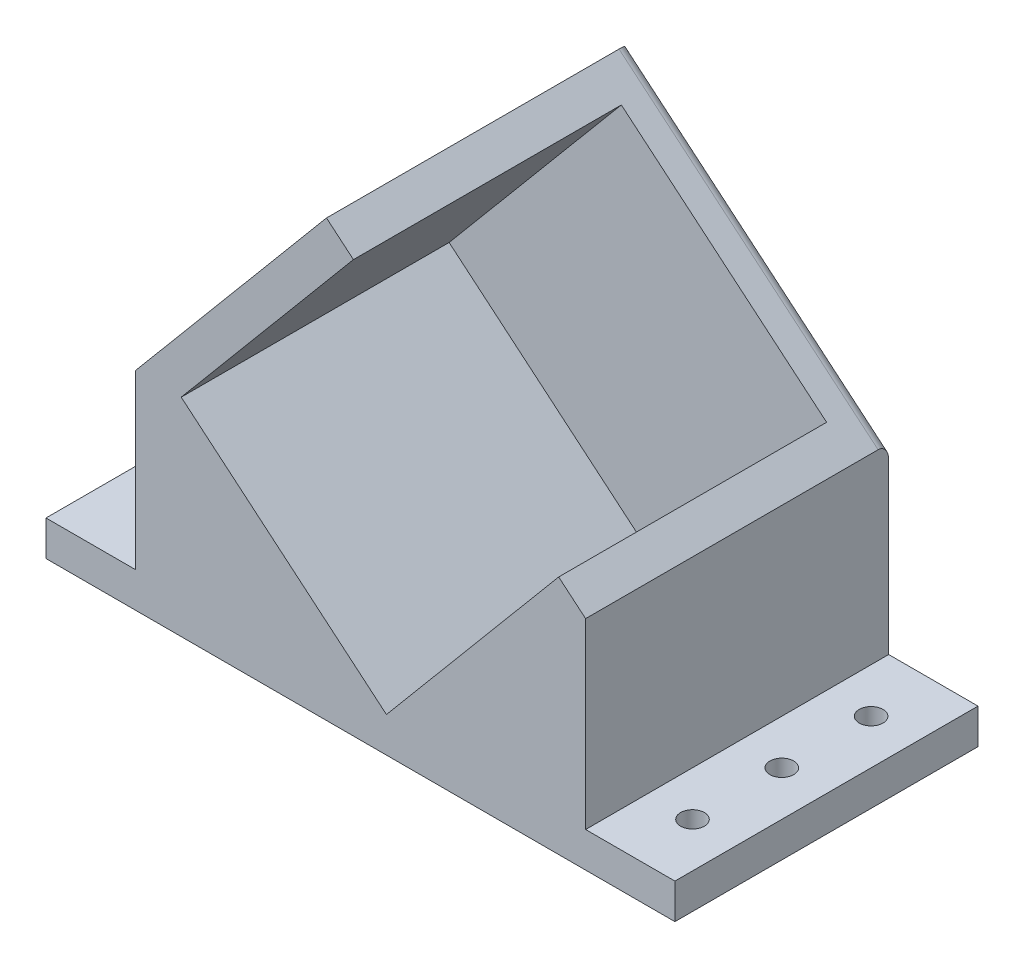
ISO-10303-21;
HEADER;
FILE_DESCRIPTION(('STEP AP214'),'2;1');
FILE_NAME('part.step','',(''),(''),'','','');
FILE_SCHEMA(('AUTOMOTIVE_DESIGN { 1 0 10303 214 1 1 1 1 }'));
ENDSEC;
DATA;
#1=APPLICATION_CONTEXT('core data for automotive mechanical design processes');
#2=APPLICATION_PROTOCOL_DEFINITION('international standard','automotive_design',2000,#1);
#3=PRODUCT_CONTEXT('',#1,'mechanical');
#4=PRODUCT('Part','Part','',(#3));
#5=PRODUCT_RELATED_PRODUCT_CATEGORY('part','',(#4));
#6=PRODUCT_DEFINITION_FORMATION('','',#4);
#7=PRODUCT_DEFINITION_CONTEXT('part definition',#1,'design');
#8=PRODUCT_DEFINITION('design','',#6,#7);
#9=PRODUCT_DEFINITION_SHAPE('','',#8);
#10=(LENGTH_UNIT() NAMED_UNIT(*) SI_UNIT(.MILLI.,.METRE.));
#11=(NAMED_UNIT(*) PLANE_ANGLE_UNIT() SI_UNIT($,.RADIAN.));
#12=(NAMED_UNIT(*) SI_UNIT($,.STERADIAN.) SOLID_ANGLE_UNIT());
#13=UNCERTAINTY_MEASURE_WITH_UNIT(LENGTH_MEASURE(1.E-05),#10,'distance_accuracy_value','');
#14=(GEOMETRIC_REPRESENTATION_CONTEXT(3) GLOBAL_UNCERTAINTY_ASSIGNED_CONTEXT((#13)) GLOBAL_UNIT_ASSIGNED_CONTEXT((#10,
#11,#12)) REPRESENTATION_CONTEXT('',''));
#15=CARTESIAN_POINT('',(0.,0.,0.));
#16=DIRECTION('',(0.,0.,1.));
#17=DIRECTION('',(1.,0.,0.));
#18=AXIS2_PLACEMENT_3D('',#15,#16,#17);
#19=CARTESIAN_POINT('',(29.186293282833,-24.4902079290572,-76.2));
#20=DIRECTION('',(-0.64278760968654,-0.766044443118977,0.));
#21=DIRECTION('',(0.766044443118977,-0.64278760968654,0.));
#22=AXIS2_PLACEMENT_3D('',#19,#20,#21);
#23=PLANE('',#22);
#24=DIRECTION('',(-0.766044443118977,0.64278760968654,0.));
#25=VECTOR('',#24,1.);
#26=CARTESIAN_POINT('',(29.186293282833,-24.4902079290572,0.));
#27=LINE('',#26,#25);
#28=CARTESIAN_POINT('',(29.186293282833,-24.4902079290572,0.));
#29=VERTEX_POINT('',#28);
#30=CARTESIAN_POINT('',(-29.186293282833,24.4902079290572,0.));
#31=VERTEX_POINT('',#30);
#32=EDGE_CURVE('E284',#29,#31,#27,.T.);
#33=ORIENTED_EDGE('',*,*,#32,.F.);
#34=DIRECTION('',(0.,0.,1.));
#35=VECTOR('',#34,1.);
#36=CARTESIAN_POINT('',(29.186293282833,-24.4902079290572,-76.2));
#37=LINE('',#36,#35);
#38=CARTESIAN_POINT('',(29.186293282833,-24.4902079290572,-76.2));
#39=VERTEX_POINT('',#38);
#40=EDGE_CURVE('E295',#39,#29,#37,.T.);
#41=ORIENTED_EDGE('',*,*,#40,.F.);
#42=DIRECTION('',(-0.766044443118977,0.64278760968654,0.));
#43=VECTOR('',#42,1.);
#44=CARTESIAN_POINT('',(29.186293282833,-24.4902079290572,-76.2));
#45=LINE('',#44,#43);
#46=CARTESIAN_POINT('',(-29.186293282833,24.4902079290572,-76.2));
#47=VERTEX_POINT('',#46);
#48=EDGE_CURVE('E286',#39,#47,#45,.T.);
#49=ORIENTED_EDGE('',*,*,#48,.T.);
#50=DIRECTION('',(0.,0.,1.));
#51=VECTOR('',#50,1.);
#52=CARTESIAN_POINT('',(-29.186293282833,24.4902079290572,-76.2));
#53=LINE('',#52,#51);
#54=EDGE_CURVE('E332',#47,#31,#53,.T.);
#55=ORIENTED_EDGE('',*,*,#54,.T.);
#56=EDGE_LOOP('',(#33,#41,#49,#55));
#57=FACE_BOUND('',#56,.T.);
#58=ADVANCED_FACE('F37',(#57),#23,.F.);
#59=CARTESIAN_POINT('',(-29.186293282833,24.4902079290572,-76.2));
#60=DIRECTION('',(-0.766044443118977,0.642787609686541,0.));
#61=DIRECTION('',(-0.642787609686541,-0.766044443118977,0.));
#62=AXIS2_PLACEMENT_3D('',#59,#60,#61);
#63=PLANE('',#62);
#64=DIRECTION('',(0.642787609686541,0.766044443118977,0.));
#65=VECTOR('',#64,1.);
#66=CARTESIAN_POINT('',(-29.186293282833,24.4902079290572,0.));
#67=LINE('',#66,#65);
#68=CARTESIAN_POINT('',(19.7941225752814,82.8627944947232,0.));
#69=VERTEX_POINT('',#68);
#70=EDGE_CURVE('E297',#31,#69,#67,.T.);
#71=ORIENTED_EDGE('',*,*,#70,.F.);
#72=ORIENTED_EDGE('',*,*,#54,.F.);
#73=DIRECTION('',(0.642787609686541,0.766044443118977,0.));
#74=VECTOR('',#73,1.);
#75=CARTESIAN_POINT('',(-29.186293282833,24.4902079290572,-76.2));
#76=LINE('',#75,#74);
#77=CARTESIAN_POINT('',(19.7941225752814,82.8627944947232,-76.2));
#78=VERTEX_POINT('',#77);
#79=EDGE_CURVE('E289',#47,#78,#76,.T.);
#80=ORIENTED_EDGE('',*,*,#79,.T.);
#81=DIRECTION('',(0.,0.,1.));
#82=VECTOR('',#81,1.);
#83=CARTESIAN_POINT('',(19.7941225752814,82.8627944947232,-76.2));
#84=LINE('',#83,#82);
#85=EDGE_CURVE('E329',#78,#69,#84,.T.);
#86=ORIENTED_EDGE('',*,*,#85,.T.);
#87=EDGE_LOOP('',(#71,#72,#80,#86));
#88=FACE_BOUND('',#87,.T.);
#89=ADVANCED_FACE('F438',(#88),#63,.F.);
#90=CARTESIAN_POINT('',(-42.2403661761558,24.4902079290572,-76.2));
#91=DIRECTION('',(0.766044443118978,-0.64278760968654,0.));
#92=DIRECTION('',(0.64278760968654,0.766044443118978,0.));
#93=AXIS2_PLACEMENT_3D('',#90,#91,#92);
#94=PLANE('',#93);
#95=DIRECTION('',(-0.64278760968654,-0.766044443118978,0.));
#96=VECTOR('',#95,1.);
#97=CARTESIAN_POINT('',(-42.2403661761558,24.4902079290572,-86.2));
#98=LINE('',#97,#96);
#99=CARTESIAN_POINT('',(10.205315315032,86.9925372622317,-86.2));
#100=VERTEX_POINT('',#99);
#101=CARTESIAN_POINT('',(-42.2403661761558,24.4902079290572,-86.2));
#102=VERTEX_POINT('',#101);
#103=EDGE_CURVE('E272',#100,#102,#98,.T.);
#104=ORIENTED_EDGE('',*,*,#103,.T.);
#105=DIRECTION('',(0.,0.,1.));
#106=VECTOR('',#105,1.);
#107=CARTESIAN_POINT('',(-42.2403661761558,24.4902079290572,-76.2));
#108=LINE('',#107,#106);
#109=CARTESIAN_POINT('',(-42.2403661761558,24.4902079290572,0.));
#110=VERTEX_POINT('',#109);
#111=EDGE_CURVE('E323',#102,#110,#108,.T.);
#112=ORIENTED_EDGE('',*,*,#111,.T.);
#113=DIRECTION('',(-0.64278760968654,-0.766044443118978,0.));
#114=VECTOR('',#113,1.);
#115=CARTESIAN_POINT('',(-42.2403661761558,24.4902079290572,0.));
#116=LINE('',#115,#114);
#117=CARTESIAN_POINT('',(12.1336781440916,89.2906705915887,0.));
#118=VERTEX_POINT('',#117);
#119=EDGE_CURVE('E302',#118,#110,#116,.T.);
#120=ORIENTED_EDGE('',*,*,#119,.F.);
#121=DIRECTION('',(0.,0.,1.));
#122=VECTOR('',#121,1.);
#123=CARTESIAN_POINT('',(12.1336781440916,89.2906705915887,-76.2));
#124=LINE('',#123,#122);
#125=CARTESIAN_POINT('',(12.1336781440916,89.2906705915887,-83.2));
#126=VERTEX_POINT('',#125);
#127=EDGE_CURVE('E326',#126,#118,#124,.T.);
#128=ORIENTED_EDGE('',*,*,#127,.F.);
#129=CARTESIAN_POINT('',(10.205315315032,86.9925372622317,-83.2));
#130=DIRECTION('',(-0.766044443118978,0.64278760968654,0.));
#131=DIRECTION('',(0.64278760968654,0.766044443118978,0.));
#132=AXIS2_PLACEMENT_3D('',#129,#130,#131);
#133=CIRCLE('',#132,3.);
#134=EDGE_CURVE('E377',#100,#126,#133,.F.);
#135=ORIENTED_EDGE('',*,*,#134,.F.);
#136=EDGE_LOOP('',(#104,#112,#120,#128,#135));
#137=FACE_BOUND('',#136,.T.);
#138=ADVANCED_FACE('F444',(#137),#94,.F.);
#139=CARTESIAN_POINT('',(-42.2403661761558,-34.4902079290572,-76.2));
#140=DIRECTION('',(1.,0.,0.));
#141=DIRECTION('',(0.,1.,0.));
#142=AXIS2_PLACEMENT_3D('',#139,#140,#141);
#143=PLANE('',#142);
#144=DIRECTION('',(0.,-1.,0.));
#145=VECTOR('',#144,1.);
#146=CARTESIAN_POINT('',(-42.2403661761558,-34.4902079290572,0.));
#147=LINE('',#146,#145);
#148=CARTESIAN_POINT('',(-42.2403661761558,-24.4902079290572,0.));
#149=VERTEX_POINT('',#148);
#150=EDGE_CURVE('E305',#110,#149,#147,.T.);
#151=ORIENTED_EDGE('',*,*,#150,.F.);
#152=ORIENTED_EDGE('',*,*,#111,.F.);
#153=DIRECTION('',(0.,-1.,0.));
#154=VECTOR('',#153,1.);
#155=CARTESIAN_POINT('',(-42.2403661761558,-34.4902079290572,-86.2));
#156=LINE('',#155,#154);
#157=CARTESIAN_POINT('',(-42.2403661761558,-24.4902079290572,-86.2));
#158=VERTEX_POINT('',#157);
#159=EDGE_CURVE('E275',#102,#158,#156,.T.);
#160=ORIENTED_EDGE('',*,*,#159,.T.);
#161=DIRECTION('',(0.,0.,-1.));
#162=VECTOR('',#161,1.);
#163=CARTESIAN_POINT('',(-42.2403661761558,-24.4902079290572,-86.2));
#164=LINE('',#163,#162);
#165=EDGE_CURVE('E230',#149,#158,#164,.T.);
#166=ORIENTED_EDGE('',*,*,#165,.F.);
#167=EDGE_LOOP('',(#151,#152,#160,#166));
#168=FACE_BOUND('',#167,.T.);
#169=ADVANCED_FACE('F616',(#168),#143,.F.);
#170=CARTESIAN_POINT('',(85.8271535721372,-34.4902079290572,-76.2));
#171=DIRECTION('',(0.,1.,0.));
#172=DIRECTION('',(-1.,0.,0.));
#173=AXIS2_PLACEMENT_3D('',#170,#171,#172);
#174=PLANE('',#173);
#175=CARTESIAN_POINT('',(-54.9403661761558,-34.4902079290572,-68.5));
#176=DIRECTION('',(0.,-1.,0.));
#177=DIRECTION('',(0.,0.,-1.));
#178=AXIS2_PLACEMENT_3D('',#175,#176,#177);
#179=CIRCLE('',#178,3.3782);
#180=CARTESIAN_POINT('',(-54.9403661761558,-34.4902079290572,-71.8782));
#181=VERTEX_POINT('',#180);
#182=EDGE_CURVE('E673',#181,#181,#179,.T.);
#183=ORIENTED_EDGE('',*,*,#182,.F.);
#184=EDGE_LOOP('',(#183));
#185=FACE_BOUND('',#184,.T.);
#186=CARTESIAN_POINT('',(-54.9403661761558,-34.4902079290572,-43.1));
#187=DIRECTION('',(0.,-1.,0.));
#188=DIRECTION('',(0.,0.,-1.));
#189=AXIS2_PLACEMENT_3D('',#186,#187,#188);
#190=CIRCLE('',#189,3.3782);
#191=CARTESIAN_POINT('',(-54.9403661761558,-34.4902079290572,-46.4782));
#192=VERTEX_POINT('',#191);
#193=EDGE_CURVE('E667',#192,#192,#190,.T.);
#194=ORIENTED_EDGE('',*,*,#193,.F.);
#195=EDGE_LOOP('',(#194));
#196=FACE_BOUND('',#195,.T.);
#197=CARTESIAN_POINT('',(-54.9403661761558,-34.4902079290572,-17.7));
#198=DIRECTION('',(0.,-1.,0.));
#199=DIRECTION('',(0.,0.,-1.));
#200=AXIS2_PLACEMENT_3D('',#197,#198,#199);
#201=CIRCLE('',#200,3.3782);
#202=CARTESIAN_POINT('',(-54.9403661761558,-34.4902079290572,-21.0782));
#203=VERTEX_POINT('',#202);
#204=EDGE_CURVE('E661',#203,#203,#201,.T.);
#205=ORIENTED_EDGE('',*,*,#204,.F.);
#206=EDGE_LOOP('',(#205));
#207=FACE_BOUND('',#206,.T.);
#208=CARTESIAN_POINT('',(98.5271535721371,-34.4902079290572,-17.7));
#209=DIRECTION('',(0.,-1.,0.));
#210=DIRECTION('',(0.,0.,-1.));
#211=AXIS2_PLACEMENT_3D('',#208,#209,#210);
#212=CIRCLE('',#211,3.3782);
#213=CARTESIAN_POINT('',(98.5271535721371,-34.4902079290572,-21.0782));
#214=VERTEX_POINT('',#213);
#215=EDGE_CURVE('E655',#214,#214,#212,.T.);
#216=ORIENTED_EDGE('',*,*,#215,.F.);
#217=EDGE_LOOP('',(#216));
#218=FACE_BOUND('',#217,.T.);
#219=CARTESIAN_POINT('',(98.5271535721372,-34.4902079290572,-43.1));
#220=DIRECTION('',(0.,-1.,0.));
#221=DIRECTION('',(0.,0.,-1.));
#222=AXIS2_PLACEMENT_3D('',#219,#220,#221);
#223=CIRCLE('',#222,3.3782);
#224=CARTESIAN_POINT('',(98.5271535721372,-34.4902079290572,-46.4782));
#225=VERTEX_POINT('',#224);
#226=EDGE_CURVE('E649',#225,#225,#223,.T.);
#227=ORIENTED_EDGE('',*,*,#226,.F.);
#228=EDGE_LOOP('',(#227));
#229=FACE_BOUND('',#228,.T.);
#230=CARTESIAN_POINT('',(98.5271535721371,-34.4902079290572,-68.5));
#231=DIRECTION('',(0.,-1.,0.));
#232=DIRECTION('',(0.,0.,-1.));
#233=AXIS2_PLACEMENT_3D('',#230,#231,#232);
#234=CIRCLE('',#233,3.3782);
#235=CARTESIAN_POINT('',(98.5271535721371,-34.4902079290572,-71.8782));
#236=VERTEX_POINT('',#235);
#237=EDGE_CURVE('E639',#236,#236,#234,.T.);
#238=ORIENTED_EDGE('',*,*,#237,.F.);
#239=EDGE_LOOP('',(#238));
#240=FACE_BOUND('',#239,.T.);
#241=DIRECTION('',(1.,0.,0.));
#242=VECTOR('',#241,1.);
#243=CARTESIAN_POINT('',(85.8271535721372,-34.4902079290572,0.));
#244=LINE('',#243,#242);
#245=CARTESIAN_POINT('',(-67.6403661761558,-34.4902079290572,0.));
#246=VERTEX_POINT('',#245);
#247=CARTESIAN_POINT('',(111.227153572137,-34.4902079290572,0.));
#248=VERTEX_POINT('',#247);
#249=EDGE_CURVE('E218',#246,#248,#244,.T.);
#250=ORIENTED_EDGE('',*,*,#249,.F.);
#251=DIRECTION('',(0.,0.,1.));
#252=VECTOR('',#251,1.);
#253=CARTESIAN_POINT('',(-67.6403661761558,-34.4902079290572,0.));
#254=LINE('',#253,#252);
#255=CARTESIAN_POINT('',(-67.6403661761558,-34.4902079290572,-86.2));
#256=VERTEX_POINT('',#255);
#257=EDGE_CURVE('E220',#256,#246,#254,.T.);
#258=ORIENTED_EDGE('',*,*,#257,.F.);
#259=DIRECTION('',(1.,0.,0.));
#260=VECTOR('',#259,1.);
#261=CARTESIAN_POINT('',(85.8271535721372,-34.4902079290572,-86.2));
#262=LINE('',#261,#260);
#263=CARTESIAN_POINT('',(111.227153572137,-34.4902079290572,-86.2));
#264=VERTEX_POINT('',#263);
#265=EDGE_CURVE('E278',#256,#264,#262,.T.);
#266=ORIENTED_EDGE('',*,*,#265,.T.);
#267=DIRECTION('',(0.,0.,-1.));
#268=VECTOR('',#267,1.);
#269=CARTESIAN_POINT('',(111.227153572137,-34.4902079290572,-86.2));
#270=LINE('',#269,#268);
#271=EDGE_CURVE('E637',#248,#264,#270,.T.);
#272=ORIENTED_EDGE('',*,*,#271,.F.);
#273=EDGE_LOOP('',(#250,#258,#266,#272));
#274=FACE_BOUND('',#273,.T.);
#275=ADVANCED_FACE('F612',(#185,#196,#207,#218,#229,#240,#274),#174,.F.);
#276=CARTESIAN_POINT('',(85.8271535721371,27.4545025397435,-76.2));
#277=DIRECTION('',(-1.,0.,0.));
#278=DIRECTION('',(0.,-1.,0.));
#279=AXIS2_PLACEMENT_3D('',#276,#277,#278);
#280=PLANE('',#279);
#281=DIRECTION('',(0.,1.,0.));
#282=VECTOR('',#281,1.);
#283=CARTESIAN_POINT('',(85.8271535721371,27.4545025397435,-86.2));
#284=LINE('',#283,#282);
#285=CARTESIAN_POINT('',(85.8271535721372,-24.4902079290572,-86.2));
#286=VERTEX_POINT('',#285);
#287=CARTESIAN_POINT('',(85.8271535721371,23.5382806717467,-86.2));
#288=VERTEX_POINT('',#287);
#289=EDGE_CURVE('E281',#286,#288,#284,.T.);
#290=ORIENTED_EDGE('',*,*,#289,.T.);
#291=CARTESIAN_POINT('',(85.8271535721371,23.5382806717467,-83.2));
#292=DIRECTION('',(1.,0.,0.));
#293=DIRECTION('',(0.,1.,0.));
#294=AXIS2_PLACEMENT_3D('',#291,#292,#293);
#295=ELLIPSE('',#294,3.91622186799684,3.);
#296=CARTESIAN_POINT('',(85.8271535721371,27.4545025397435,-83.2));
#297=VERTEX_POINT('',#296);
#298=EDGE_CURVE('E382',#297,#288,#295,.F.);
#299=ORIENTED_EDGE('',*,*,#298,.F.);
#300=DIRECTION('',(0.,0.,1.));
#301=VECTOR('',#300,1.);
#302=CARTESIAN_POINT('',(85.8271535721371,27.4545025397435,-76.2));
#303=LINE('',#302,#301);
#304=CARTESIAN_POINT('',(85.8271535721371,27.4545025397435,0.));
#305=VERTEX_POINT('',#304);
#306=EDGE_CURVE('E320',#297,#305,#303,.T.);
#307=ORIENTED_EDGE('',*,*,#306,.T.);
#308=DIRECTION('',(0.,1.,0.));
#309=VECTOR('',#308,1.);
#310=CARTESIAN_POINT('',(85.8271535721371,27.4545025397435,0.));
#311=LINE('',#310,#309);
#312=CARTESIAN_POINT('',(85.8271535721372,-24.4902079290572,0.));
#313=VERTEX_POINT('',#312);
#314=EDGE_CURVE('E309',#313,#305,#311,.T.);
#315=ORIENTED_EDGE('',*,*,#314,.F.);
#316=DIRECTION('',(0.,0.,1.));
#317=VECTOR('',#316,1.);
#318=CARTESIAN_POINT('',(85.8271535721372,-24.4902079290572,-86.2));
#319=LINE('',#318,#317);
#320=EDGE_CURVE('E211',#286,#313,#319,.T.);
#321=ORIENTED_EDGE('',*,*,#320,.F.);
#322=EDGE_LOOP('',(#290,#299,#307,#315,#321));
#323=FACE_BOUND('',#322,.T.);
#324=ADVANCED_FACE('F608',(#323),#280,.F.);
#325=CARTESIAN_POINT('',(78.1667091409474,33.8823786366089,-76.2));
#326=DIRECTION('',(-0.64278760968654,-0.766044443118977,0.));
#327=DIRECTION('',(0.766044443118977,-0.64278760968654,0.));
#328=AXIS2_PLACEMENT_3D('',#325,#326,#327);
#329=PLANE('',#328);
#330=ORIENTED_EDGE('',*,*,#127,.T.);
#331=DIRECTION('',(-0.766044443118978,0.64278760968654,0.));
#332=VECTOR('',#331,1.);
#333=CARTESIAN_POINT('',(12.1336781440916,89.2906705915887,0.));
#334=LINE('',#333,#332);
#335=EDGE_CURVE('E300',#69,#118,#334,.T.);
#336=ORIENTED_EDGE('',*,*,#335,.F.);
#337=ORIENTED_EDGE('',*,*,#85,.F.);
#338=DIRECTION('',(-0.766044443118977,0.64278760968654,0.));
#339=VECTOR('',#338,1.);
#340=CARTESIAN_POINT('',(12.1336781440916,89.2906705915887,-76.2));
#341=LINE('',#340,#339);
#342=CARTESIAN_POINT('',(78.1667091409474,33.8823786366089,-76.2));
#343=VERTEX_POINT('',#342);
#344=EDGE_CURVE('E257',#343,#78,#341,.T.);
#345=ORIENTED_EDGE('',*,*,#344,.F.);
#346=DIRECTION('',(0.,0.,1.));
#347=VECTOR('',#346,1.);
#348=CARTESIAN_POINT('',(78.1667091409474,33.8823786366089,-76.2));
#349=LINE('',#348,#347);
#350=CARTESIAN_POINT('',(78.1667091409474,33.8823786366089,0.));
#351=VERTEX_POINT('',#350);
#352=EDGE_CURVE('E317',#343,#351,#349,.T.);
#353=ORIENTED_EDGE('',*,*,#352,.T.);
#354=DIRECTION('',(-0.766044443118977,0.64278760968654,0.));
#355=VECTOR('',#354,1.);
#356=CARTESIAN_POINT('',(78.1667091409474,33.8823786366089,0.));
#357=LINE('',#356,#355);
#358=EDGE_CURVE('E311',#305,#351,#357,.T.);
#359=ORIENTED_EDGE('',*,*,#358,.F.);
#360=ORIENTED_EDGE('',*,*,#306,.F.);
#361=DIRECTION('',(-0.766044443118977,0.64278760968654,0.));
#362=VECTOR('',#361,1.);
#363=CARTESIAN_POINT('',(78.1667091409474,33.8823786366089,-83.2));
#364=LINE('',#363,#362);
#365=EDGE_CURVE('E380',#126,#297,#364,.F.);
#366=ORIENTED_EDGE('',*,*,#365,.F.);
#367=EDGE_LOOP('',(#330,#336,#337,#345,#353,#359,#360,#366));
#368=FACE_BOUND('',#367,.T.);
#369=ADVANCED_FACE('F604',(#368),#329,.F.);
#370=CARTESIAN_POINT('',(78.1667091409474,33.8823786366089,-76.2));
#371=DIRECTION('',(0.766044443118977,-0.64278760968654,0.));
#372=DIRECTION('',(0.64278760968654,0.766044443118977,0.));
#373=AXIS2_PLACEMENT_3D('',#370,#371,#372);
#374=PLANE('',#373);
#375=DIRECTION('',(-0.64278760968654,-0.766044443118977,0.));
#376=VECTOR('',#375,1.);
#377=CARTESIAN_POINT('',(78.1667091409474,33.8823786366089,0.));
#378=LINE('',#377,#376);
#379=EDGE_CURVE('E290',#351,#29,#378,.T.);
#380=ORIENTED_EDGE('',*,*,#379,.F.);
#381=ORIENTED_EDGE('',*,*,#352,.F.);
#382=DIRECTION('',(-0.64278760968654,-0.766044443118977,0.));
#383=VECTOR('',#382,1.);
#384=CARTESIAN_POINT('',(78.1667091409474,33.8823786366089,-76.2));
#385=LINE('',#384,#383);
#386=EDGE_CURVE('E293',#343,#39,#385,.T.);
#387=ORIENTED_EDGE('',*,*,#386,.T.);
#388=ORIENTED_EDGE('',*,*,#40,.T.);
#389=EDGE_LOOP('',(#380,#381,#387,#388));
#390=FACE_BOUND('',#389,.T.);
#391=ADVANCED_FACE('F601',(#390),#374,.F.);
#392=CARTESIAN_POINT('',(0.,0.,0.));
#393=DIRECTION('',(0.,0.,1.));
#394=DIRECTION('',(-1.,0.,0.));
#395=AXIS2_PLACEMENT_3D('',#392,#393,#394);
#396=PLANE('',#395);
#397=ORIENTED_EDGE('',*,*,#32,.T.);
#398=ORIENTED_EDGE('',*,*,#70,.T.);
#399=ORIENTED_EDGE('',*,*,#335,.T.);
#400=ORIENTED_EDGE('',*,*,#119,.T.);
#401=ORIENTED_EDGE('',*,*,#150,.T.);
#402=DIRECTION('',(1.,0.,0.));
#403=VECTOR('',#402,1.);
#404=CARTESIAN_POINT('',(-42.2403661761558,-24.4902079290572,0.));
#405=LINE('',#404,#403);
#406=CARTESIAN_POINT('',(-67.6403661761558,-24.4902079290572,0.));
#407=VERTEX_POINT('',#406);
#408=EDGE_CURVE('E228',#407,#149,#405,.T.);
#409=ORIENTED_EDGE('',*,*,#408,.F.);
#410=DIRECTION('',(0.,-1.,0.));
#411=VECTOR('',#410,1.);
#412=CARTESIAN_POINT('',(-67.6403661761558,-24.4902079290572,0.));
#413=LINE('',#412,#411);
#414=EDGE_CURVE('E235',#407,#246,#413,.T.);
#415=ORIENTED_EDGE('',*,*,#414,.T.);
#416=ORIENTED_EDGE('',*,*,#249,.T.);
#417=DIRECTION('',(0.,-1.,0.));
#418=VECTOR('',#417,1.);
#419=CARTESIAN_POINT('',(111.227153572137,-24.4902079290572,0.));
#420=LINE('',#419,#418);
#421=CARTESIAN_POINT('',(111.227153572137,-24.4902079290572,0.));
#422=VERTEX_POINT('',#421);
#423=EDGE_CURVE('E202',#422,#248,#420,.T.);
#424=ORIENTED_EDGE('',*,*,#423,.F.);
#425=DIRECTION('',(1.,0.,0.));
#426=VECTOR('',#425,1.);
#427=CARTESIAN_POINT('',(85.8271535721372,-24.4902079290572,0.));
#428=LINE('',#427,#426);
#429=EDGE_CURVE('E52',#313,#422,#428,.T.);
#430=ORIENTED_EDGE('',*,*,#429,.F.);
#431=ORIENTED_EDGE('',*,*,#314,.T.);
#432=ORIENTED_EDGE('',*,*,#358,.T.);
#433=ORIENTED_EDGE('',*,*,#379,.T.);
#434=EDGE_LOOP('',(#397,#398,#399,#400,#401,#409,#415,#416,#424,#430,#431,#432,#433));
#435=FACE_BOUND('',#434,.T.);
#436=ADVANCED_FACE('F216',(#435),#396,.T.);
#437=CARTESIAN_POINT('',(0.,0.,-86.2));
#438=DIRECTION('',(0.,0.,1.));
#439=DIRECTION('',(-1.,0.,0.));
#440=AXIS2_PLACEMENT_3D('',#437,#438,#439);
#441=PLANE('',#440);
#442=DIRECTION('',(-0.766044443118977,0.64278760968654,0.));
#443=VECTOR('',#442,1.);
#444=CARTESIAN_POINT('',(45.2628106516958,22.3298090432662,-86.2));
#445=LINE('',#444,#443);
#446=CARTESIAN_POINT('',(62.1157884003134,8.1884816301623,-86.2));
#447=VERTEX_POINT('',#446);
#448=CARTESIAN_POINT('',(45.2628106516958,22.3298090432662,-86.2));
#449=VERTEX_POINT('',#448);
#450=EDGE_CURVE('E244',#447,#449,#445,.T.);
#451=ORIENTED_EDGE('',*,*,#450,.T.);
#452=DIRECTION('',(0.642787609686541,0.766044443118977,0.));
#453=VECTOR('',#452,1.);
#454=CARTESIAN_POINT('',(38.8349345548304,14.6693646120765,-86.2));
#455=LINE('',#454,#453);
#456=CARTESIAN_POINT('',(29.1931204095322,3.17869796529178,-86.2));
#457=VERTEX_POINT('',#456);
#458=EDGE_CURVE('E264',#457,#449,#455,.T.);
#459=ORIENTED_EDGE('',*,*,#458,.F.);
#460=DIRECTION('',(-0.766044443118978,0.64278760968654,0.));
#461=VECTOR('',#460,1.);
#462=CARTESIAN_POINT('',(13.6270973253546,16.2401421941223,-86.2));
#463=LINE('',#462,#461);
#464=CARTESIAN_POINT('',(46.0460981581498,-10.9626294478122,-86.2));
#465=VERTEX_POINT('',#464);
#466=EDGE_CURVE('E335',#465,#457,#463,.T.);
#467=ORIENTED_EDGE('',*,*,#466,.F.);
#468=DIRECTION('',(-0.642787609686541,-0.766044443118977,0.));
#469=VECTOR('',#468,1.);
#470=CARTESIAN_POINT('',(32.4190008327952,-27.2027716419345,-86.2));
#471=LINE('',#470,#469);
#472=EDGE_CURVE('E346',#447,#465,#471,.T.);
#473=ORIENTED_EDGE('',*,*,#472,.F.);
#474=EDGE_LOOP('',(#451,#459,#467,#473));
#475=FACE_BOUND('',#474,.T.);
#476=DIRECTION('',(0.642787609686541,0.766044443118977,0.));
#477=VECTOR('',#476,1.);
#478=CARTESIAN_POINT('',(-32.4190008327953,27.2027716419346,-86.2));
#479=LINE('',#478,#477);
#480=CARTESIAN_POINT('',(-18.7919035074407,43.4429138360568,-86.2));
#481=VERTEX_POINT('',#480);
#482=CARTESIAN_POINT('',(-2.72221326527714,62.5940249140313,-86.2));
#483=VERTEX_POINT('',#482);
#484=EDGE_CURVE('E349',#481,#483,#479,.T.);
#485=ORIENTED_EDGE('',*,*,#484,.F.);
#486=DIRECTION('',(-0.766044443118978,0.64278760968654,0.));
#487=VECTOR('',#486,1.);
#488=CARTESIAN_POINT('',(13.6270973253546,16.2401421941223,-86.2));
#489=LINE('',#488,#487);
#490=CARTESIAN_POINT('',(-1.93892575882302,29.3015864229528,-86.2));
#491=VERTEX_POINT('',#490);
#492=EDGE_CURVE('E338',#491,#481,#489,.T.);
#493=ORIENTED_EDGE('',*,*,#492,.F.);
#494=DIRECTION('',(0.642787609686541,0.766044443118977,0.));
#495=VECTOR('',#494,1.);
#496=CARTESIAN_POINT('',(7.70288838647515,40.7922530697375,-86.2));
#497=LINE('',#496,#495);
#498=CARTESIAN_POINT('',(14.1307644833406,48.4526975009273,-86.2));
#499=VERTEX_POINT('',#498);
#500=EDGE_CURVE('E254',#491,#499,#497,.T.);
#501=ORIENTED_EDGE('',*,*,#500,.T.);
#502=DIRECTION('',(-0.766044443118978,0.64278760968654,0.));
#503=VECTOR('',#502,1.);
#504=CARTESIAN_POINT('',(8.76845338150772,52.952210768733,-86.2));
#505=LINE('',#504,#503);
#506=EDGE_CURVE('E237',#499,#483,#505,.T.);
#507=ORIENTED_EDGE('',*,*,#506,.T.);
#508=EDGE_LOOP('',(#485,#493,#501,#507));
#509=FACE_BOUND('',#508,.T.);
#510=ORIENTED_EDGE('',*,*,#265,.F.);
#511=DIRECTION('',(0.,-1.,0.));
#512=VECTOR('',#511,1.);
#513=CARTESIAN_POINT('',(-67.6403661761558,-24.4902079290572,-86.2));
#514=LINE('',#513,#512);
#515=CARTESIAN_POINT('',(-67.6403661761558,-24.4902079290572,-86.2));
#516=VERTEX_POINT('',#515);
#517=EDGE_CURVE('E232',#516,#256,#514,.T.);
#518=ORIENTED_EDGE('',*,*,#517,.F.);
#519=DIRECTION('',(-1.,0.,0.));
#520=VECTOR('',#519,1.);
#521=CARTESIAN_POINT('',(-67.6403661761558,-24.4902079290572,-86.2));
#522=LINE('',#521,#520);
#523=EDGE_CURVE('E60',#158,#516,#522,.T.);
#524=ORIENTED_EDGE('',*,*,#523,.F.);
#525=ORIENTED_EDGE('',*,*,#159,.F.);
#526=ORIENTED_EDGE('',*,*,#103,.F.);
#527=DIRECTION('',(-0.766044443118977,0.64278760968654,0.));
#528=VECTOR('',#527,1.);
#529=CARTESIAN_POINT('',(47.0520530290548,56.0744532363091,-86.2));
#530=LINE('',#529,#528);
#531=EDGE_CURVE('E375',#288,#100,#530,.T.);
#532=ORIENTED_EDGE('',*,*,#531,.F.);
#533=ORIENTED_EDGE('',*,*,#289,.F.);
#534=DIRECTION('',(-1.,0.,0.));
#535=VECTOR('',#534,1.);
#536=CARTESIAN_POINT('',(85.8271535721372,-24.4902079290572,-86.2));
#537=LINE('',#536,#535);
#538=CARTESIAN_POINT('',(111.227153572137,-24.4902079290572,-86.2));
#539=VERTEX_POINT('',#538);
#540=EDGE_CURVE('E207',#539,#286,#537,.T.);
#541=ORIENTED_EDGE('',*,*,#540,.F.);
#542=DIRECTION('',(0.,-1.,0.));
#543=VECTOR('',#542,1.);
#544=CARTESIAN_POINT('',(111.227153572137,-24.4902079290572,-86.2));
#545=LINE('',#544,#543);
#546=EDGE_CURVE('E204',#539,#264,#545,.T.);
#547=ORIENTED_EDGE('',*,*,#546,.T.);
#548=EDGE_LOOP('',(#510,#518,#524,#525,#526,#532,#533,#541,#547));
#549=FACE_BOUND('',#548,.T.);
#550=ADVANCED_FACE('F414',(#475,#509,#549),#441,.F.);
#551=CARTESIAN_POINT('',(0.,0.,-76.2));
#552=DIRECTION('',(0.,0.,1.));
#553=DIRECTION('',(-1.,0.,0.));
#554=AXIS2_PLACEMENT_3D('',#551,#552,#553);
#555=PLANE('',#554);
#556=ORIENTED_EDGE('',*,*,#48,.F.);
#557=ORIENTED_EDGE('',*,*,#386,.F.);
#558=ORIENTED_EDGE('',*,*,#344,.T.);
#559=ORIENTED_EDGE('',*,*,#79,.F.);
#560=EDGE_LOOP('',(#556,#557,#558,#559));
#561=FACE_BOUND('',#560,.T.);
#562=ADVANCED_FACE('F587',(#561),#555,.T.);
#563=CARTESIAN_POINT('',(7.70288838647515,40.7922530697375,-86.2));
#564=DIRECTION('',(0.766044443118977,-0.642787609686541,0.));
#565=DIRECTION('',(0.642787609686541,0.766044443118977,0.));
#566=AXIS2_PLACEMENT_3D('',#563,#564,#565);
#567=PLANE('',#566);
#568=DIRECTION('',(0.,0.,1.));
#569=VECTOR('',#568,1.);
#570=CARTESIAN_POINT('',(14.1307644833406,48.4526975009273,-86.2));
#571=LINE('',#570,#569);
#572=CARTESIAN_POINT('',(14.1307644833406,48.4526975009273,-94.2));
#573=VERTEX_POINT('',#572);
#574=EDGE_CURVE('E251',#573,#499,#571,.T.);
#575=ORIENTED_EDGE('',*,*,#574,.T.);
#576=ORIENTED_EDGE('',*,*,#500,.F.);
#577=DIRECTION('',(-0.454519477672047,-0.541675220419705,0.707106781186543));
#578=VECTOR('',#577,1.);
#579=CARTESIAN_POINT('',(-1.93892575882301,29.3015864229528,-86.2));
#580=LINE('',#579,#578);
#581=CARTESIAN_POINT('',(6.49529638074517,39.3531009585207,-99.3213203435597));
#582=VERTEX_POINT('',#581);
#583=EDGE_CURVE('E344',#582,#491,#580,.T.);
#584=ORIENTED_EDGE('',*,*,#583,.F.);
#585=CARTESIAN_POINT('',(7.8588548137613,40.9781266197798,-97.2));
#586=DIRECTION('',(-0.766044443118977,0.642787609686541,0.));
#587=DIRECTION('',(0.642787609686541,0.766044443118977,0.));
#588=AXIS2_PLACEMENT_3D('',#585,#586,#587);
#589=CIRCLE('',#588,3.);
#590=CARTESIAN_POINT('',(7.8588548137613,40.9781266197798,-94.2));
#591=VERTEX_POINT('',#590);
#592=EDGE_CURVE('E45',#591,#582,#589,.F.);
#593=ORIENTED_EDGE('',*,*,#592,.F.);
#594=DIRECTION('',(0.642787609686541,0.766044443118977,0.));
#595=VECTOR('',#594,1.);
#596=CARTESIAN_POINT('',(7.70288838647515,40.7922530697375,-94.2));
#597=LINE('',#596,#595);
#598=EDGE_CURVE('E258',#591,#573,#597,.T.);
#599=ORIENTED_EDGE('',*,*,#598,.T.);
#600=EDGE_LOOP('',(#575,#576,#584,#593,#599));
#601=FACE_BOUND('',#600,.T.);
#602=ADVANCED_FACE('F393',(#601),#567,.T.);
#603=CARTESIAN_POINT('',(7.70288838647515,40.7922530697375,-94.2));
#604=DIRECTION('',(0.,0.,1.));
#605=DIRECTION('',(-1.,0.,0.));
#606=AXIS2_PLACEMENT_3D('',#603,#604,#605);
#607=PLANE('',#606);
#608=DIRECTION('',(0.642787609686541,0.766044443118977,0.));
#609=VECTOR('',#608,1.);
#610=CARTESIAN_POINT('',(38.8349345548304,14.6693646120765,-94.2));
#611=LINE('',#610,#609);
#612=CARTESIAN_POINT('',(38.9909009821166,14.8552381621189,-94.2));
#613=VERTEX_POINT('',#612);
#614=CARTESIAN_POINT('',(45.2628106516958,22.3298090432662,-94.2));
#615=VERTEX_POINT('',#614);
#616=EDGE_CURVE('E261',#613,#615,#611,.T.);
#617=ORIENTED_EDGE('',*,*,#616,.T.);
#618=DIRECTION('',(-0.766044443118977,0.642787609686541,0.));
#619=VECTOR('',#618,1.);
#620=CARTESIAN_POINT('',(14.1307644833406,48.4526975009273,-94.2));
#621=LINE('',#620,#619);
#622=EDGE_CURVE('E249',#615,#573,#621,.T.);
#623=ORIENTED_EDGE('',*,*,#622,.T.);
#624=ORIENTED_EDGE('',*,*,#598,.F.);
#625=DIRECTION('',(-0.766044443118978,0.64278760968654,0.));
#626=VECTOR('',#625,1.);
#627=CARTESIAN_POINT('',(7.85885481376129,40.9781266197799,-94.2));
#628=LINE('',#627,#626);
#629=EDGE_CURVE('E373',#613,#591,#628,.T.);
#630=ORIENTED_EDGE('',*,*,#629,.F.);
#631=EDGE_LOOP('',(#617,#623,#624,#630));
#632=FACE_BOUND('',#631,.T.);
#633=ADVANCED_FACE('F406',(#632),#607,.T.);
#634=CARTESIAN_POINT('',(38.8349345548304,14.6693646120765,-94.2));
#635=DIRECTION('',(-0.766044443118977,0.642787609686541,0.));
#636=DIRECTION('',(-0.642787609686541,-0.766044443118977,0.));
#637=AXIS2_PLACEMENT_3D('',#634,#635,#636);
#638=PLANE('',#637);
#639=DIRECTION('',(0.,0.,-1.));
#640=VECTOR('',#639,1.);
#641=CARTESIAN_POINT('',(45.2628106516958,22.3298090432662,-94.2));
#642=LINE('',#641,#640);
#643=EDGE_CURVE('E247',#449,#615,#642,.T.);
#644=ORIENTED_EDGE('',*,*,#643,.T.);
#645=ORIENTED_EDGE('',*,*,#616,.F.);
#646=CARTESIAN_POINT('',(38.9909009821166,14.8552381621189,-97.2));
#647=DIRECTION('',(0.766044443118977,-0.642787609686541,0.));
#648=DIRECTION('',(-0.642787609686541,-0.766044443118977,0.));
#649=AXIS2_PLACEMENT_3D('',#646,#647,#648);
#650=CIRCLE('',#649,3.);
#651=CARTESIAN_POINT('',(37.6273425491004,13.2302125008598,-99.3213203435597));
#652=VERTEX_POINT('',#651);
#653=EDGE_CURVE('E11',#652,#613,#650,.F.);
#654=ORIENTED_EDGE('',*,*,#653,.F.);
#655=DIRECTION('',(0.454519477672047,0.541675220419705,-0.707106781186543));
#656=VECTOR('',#655,1.);
#657=CARTESIAN_POINT('',(29.1931204095322,3.17869796529177,-86.2));
#658=LINE('',#657,#656);
#659=EDGE_CURVE('E341',#457,#652,#658,.T.);
#660=ORIENTED_EDGE('',*,*,#659,.F.);
#661=ORIENTED_EDGE('',*,*,#458,.T.);
#662=EDGE_LOOP('',(#644,#645,#654,#660,#661));
#663=FACE_BOUND('',#662,.T.);
#664=ADVANCED_FACE('F404',(#663),#638,.T.);
#665=CARTESIAN_POINT('',(44.1972456566632,10.1698513442707,-101.2));
#666=DIRECTION('',(0.,0.,-1.));
#667=DIRECTION('',(1.,0.,0.));
#668=AXIS2_PLACEMENT_3D('',#665,#666,#667);
#669=PLANE('',#668);
#670=DIRECTION('',(0.642787609686541,0.766044443118977,0.));
#671=VECTOR('',#670,1.);
#672=CARTESIAN_POINT('',(2.34057728464231,45.2917663375433,-101.2));
#673=LINE('',#672,#671);
#674=CARTESIAN_POINT('',(3.13933132161501,46.2436843307046,-101.2));
#675=VERTEX_POINT('',#674);
#676=CARTESIAN_POINT('',(8.76845338150772,52.952210768733,-101.2));
#677=VERTEX_POINT('',#676);
#678=EDGE_CURVE('E253',#675,#677,#673,.T.);
#679=ORIENTED_EDGE('',*,*,#678,.T.);
#680=DIRECTION('',(0.766044443118977,-0.64278760968654,0.));
#681=VECTOR('',#680,1.);
#682=CARTESIAN_POINT('',(50.6251217535286,17.8302957754605,-101.2));
#683=LINE('',#682,#681);
#684=CARTESIAN_POINT('',(50.6251217535286,17.8302957754605,-101.2));
#685=VERTEX_POINT('',#684);
#686=EDGE_CURVE('E241',#677,#685,#683,.T.);
#687=ORIENTED_EDGE('',*,*,#686,.T.);
#688=DIRECTION('',(0.642787609686541,0.766044443118977,0.));
#689=VECTOR('',#688,1.);
#690=CARTESIAN_POINT('',(44.1972456566632,10.1698513442707,-101.2));
#691=LINE('',#690,#689);
#692=CARTESIAN_POINT('',(44.995999693636,11.1217693374321,-101.2));
#693=VERTEX_POINT('',#692);
#694=EDGE_CURVE('E267',#693,#685,#691,.T.);
#695=ORIENTED_EDGE('',*,*,#694,.F.);
#696=DIRECTION('',(0.766044443118978,-0.64278760968654,0.));
#697=VECTOR('',#696,1.);
#698=CARTESIAN_POINT('',(44.995999693636,11.1217693374321,-101.2));
#699=LINE('',#698,#697);
#700=EDGE_CURVE('E361',#675,#693,#699,.T.);
#701=ORIENTED_EDGE('',*,*,#700,.F.);
#702=EDGE_LOOP('',(#679,#687,#695,#701));
#703=FACE_BOUND('',#702,.T.);
#704=ADVANCED_FACE('F428',(#703),#669,.T.);
#705=CARTESIAN_POINT('',(29.6967875675181,35.3912532720968,0.));
#706=DIRECTION('',(-0.64278760968654,-0.766044443118978,0.));
#707=DIRECTION('',(0.766044443118978,-0.64278760968654,0.));
#708=AXIS2_PLACEMENT_3D('',#705,#706,#707);
#709=PLANE('',#708);
#710=ORIENTED_EDGE('',*,*,#506,.F.);
#711=ORIENTED_EDGE('',*,*,#574,.F.);
#712=ORIENTED_EDGE('',*,*,#622,.F.);
#713=ORIENTED_EDGE('',*,*,#643,.F.);
#714=ORIENTED_EDGE('',*,*,#450,.F.);
#715=DIRECTION('',(0.541675220419699,-0.454519477672042,0.707106781186551));
#716=VECTOR('',#715,1.);
#717=CARTESIAN_POINT('',(78.9228034823439,-5.91427852636042,-64.2599999999996));
#718=LINE('',#717,#716);
#719=EDGE_CURVE('E356',#685,#447,#718,.T.);
#720=ORIENTED_EDGE('',*,*,#719,.F.);
#721=ORIENTED_EDGE('',*,*,#686,.F.);
#722=DIRECTION('',(0.541675220419707,-0.454519477672048,-0.707106781186541));
#723=VECTOR('',#722,1.);
#724=CARTESIAN_POINT('',(-19.5292283473071,76.6967850705537,-64.2600000000009));
#725=LINE('',#724,#723);
#726=EDGE_CURVE('E352',#483,#677,#725,.T.);
#727=ORIENTED_EDGE('',*,*,#726,.F.);
#728=EDGE_LOOP('',(#710,#711,#712,#713,#714,#720,#721,#727));
#729=FACE_BOUND('',#728,.T.);
#730=ADVANCED_FACE('F411',(#729),#709,.F.);
#731=CARTESIAN_POINT('',(13.6270973253546,16.2401421941223,-86.2));
#732=DIRECTION('',(0.454519477672041,0.541675220419698,0.707106781186552));
#733=DIRECTION('',(-0.766044443118978,0.64278760968654,0.));
#734=AXIS2_PLACEMENT_3D('',#731,#732,#733);
#735=PLANE('',#734);
#736=DIRECTION('',(-0.0711623659616692,0.81338956493024,-0.577350269189626));
#737=VECTOR('',#736,1.);
#738=CARTESIAN_POINT('',(44.3073550945298,8.91129471043085,-100.306666666667));
#739=LINE('',#738,#737);
#740=CARTESIAN_POINT('',(44.3055489287178,8.93193928012934,-100.32132034356));
#741=VERTEX_POINT('',#740);
#742=EDGE_CURVE('E358',#465,#741,#739,.T.);
#743=ORIENTED_EDGE('',*,*,#742,.F.);
#744=ORIENTED_EDGE('',*,*,#466,.T.);
#745=ORIENTED_EDGE('',*,*,#659,.T.);
#746=DIRECTION('',(-0.766044443118978,0.64278760968654,0.));
#747=VECTOR('',#746,1.);
#748=CARTESIAN_POINT('',(37.6273425491004,13.2302125008598,-99.3213203435597));
#749=LINE('',#748,#747);
#750=EDGE_CURVE('E366',#582,#652,#749,.F.);
#751=ORIENTED_EDGE('',*,*,#750,.F.);
#752=ORIENTED_EDGE('',*,*,#583,.T.);
#753=ORIENTED_EDGE('',*,*,#492,.T.);
#754=DIRECTION('',(-0.813389564930243,-0.0711623659616767,0.57735026918962));
#755=VECTOR('',#754,1.);
#756=CARTESIAN_POINT('',(1.08202065080283,45.181656899677,-100.306666666667));
#757=LINE('',#756,#755);
#758=CARTESIAN_POINT('',(1.10266522050105,45.183463065489,-100.32132034356));
#759=VERTEX_POINT('',#758);
#760=EDGE_CURVE('E354',#759,#481,#757,.T.);
#761=ORIENTED_EDGE('',*,*,#760,.F.);
#762=DIRECTION('',(0.766044443118978,-0.64278760968654,0.));
#763=VECTOR('',#762,1.);
#764=CARTESIAN_POINT('',(1.77577288859888,44.6186586694455,-100.32132034356));
#765=LINE('',#764,#763);
#766=EDGE_CURVE('E368',#741,#759,#765,.F.);
#767=ORIENTED_EDGE('',*,*,#766,.F.);
#768=EDGE_LOOP('',(#743,#744,#745,#751,#752,#753,#761,#767));
#769=FACE_BOUND('',#768,.T.);
#770=ADVANCED_FACE('F396',(#769),#735,.F.);
#771=CARTESIAN_POINT('',(-32.4190008327953,27.2027716419346,-86.2));
#772=DIRECTION('',(0.541675220419696,-0.454519477672041,0.707106781186554));
#773=DIRECTION('',(0.642787609686541,0.766044443118977,0.));
#774=AXIS2_PLACEMENT_3D('',#771,#772,#773);
#775=PLANE('',#774);
#776=ORIENTED_EDGE('',*,*,#760,.T.);
#777=ORIENTED_EDGE('',*,*,#484,.T.);
#778=ORIENTED_EDGE('',*,*,#726,.T.);
#779=ORIENTED_EDGE('',*,*,#678,.F.);
#780=CARTESIAN_POINT('',(0.841197992258041,48.1720471597642,-98.2));
#781=DIRECTION('',(-0.541675220419696,0.454519477672041,-0.707106781186554));
#782=DIRECTION('',(-0.541675220419707,0.454519477672047,0.707106781186541));
#783=AXIS2_PLACEMENT_3D('',#780,#781,#782);
#784=ELLIPSE('',#783,4.24264068711932,3.);
#785=EDGE_CURVE('E371',#759,#675,#784,.F.);
#786=ORIENTED_EDGE('',*,*,#785,.F.);
#787=EDGE_LOOP('',(#776,#777,#778,#779,#786));
#788=FACE_BOUND('',#787,.T.);
#789=ADVANCED_FACE('F416',(#788),#775,.F.);
#790=CARTESIAN_POINT('',(44.1972456566632,10.1698513442707,-101.2));
#791=DIRECTION('',(-0.541675220419704,0.454519477672047,0.707106781186544));
#792=DIRECTION('',(0.642787609686541,0.766044443118977,0.));
#793=AXIS2_PLACEMENT_3D('',#790,#791,#792);
#794=PLANE('',#793);
#795=ORIENTED_EDGE('',*,*,#694,.T.);
#796=ORIENTED_EDGE('',*,*,#719,.T.);
#797=ORIENTED_EDGE('',*,*,#472,.T.);
#798=ORIENTED_EDGE('',*,*,#742,.T.);
#799=CARTESIAN_POINT('',(47.2941330229931,9.1934065083723,-98.2));
#800=DIRECTION('',(0.541675220419704,-0.454519477672047,-0.707106781186544));
#801=DIRECTION('',(-0.541675220419699,0.454519477672041,-0.707106781186551));
#802=AXIS2_PLACEMENT_3D('',#799,#800,#801);
#803=ELLIPSE('',#802,4.24264068711926,3.);
#804=EDGE_CURVE('E364',#693,#741,#803,.F.);
#805=ORIENTED_EDGE('',*,*,#804,.F.);
#806=EDGE_LOOP('',(#795,#796,#797,#798,#805));
#807=FACE_BOUND('',#806,.T.);
#808=ADVANCED_FACE('F421',(#807),#794,.F.);
#809=CARTESIAN_POINT('',(44.995999693636,11.1217693374321,-98.2));
#810=DIRECTION('',(-0.766044443118978,0.64278760968654,0.));
#811=DIRECTION('',(-0.64278760968654,-0.766044443118978,0.));
#812=AXIS2_PLACEMENT_3D('',#809,#810,#811);
#813=CYLINDRICAL_SURFACE('',#812,3.);
#814=ORIENTED_EDGE('',*,*,#785,.T.);
#815=ORIENTED_EDGE('',*,*,#700,.T.);
#816=ORIENTED_EDGE('',*,*,#804,.T.);
#817=ORIENTED_EDGE('',*,*,#766,.T.);
#818=EDGE_LOOP('',(#814,#815,#816,#817));
#819=FACE_BOUND('',#818,.T.);
#820=ADVANCED_FACE('F429',(#819),#813,.T.);
#821=CARTESIAN_POINT('',(7.8588548137613,40.9781266197798,-97.2));
#822=DIRECTION('',(0.766044443118978,-0.64278760968654,0.));
#823=DIRECTION('',(0.64278760968654,0.766044443118978,0.));
#824=AXIS2_PLACEMENT_3D('',#821,#822,#823);
#825=CYLINDRICAL_SURFACE('',#824,3.);
#826=ORIENTED_EDGE('',*,*,#653,.T.);
#827=ORIENTED_EDGE('',*,*,#629,.T.);
#828=ORIENTED_EDGE('',*,*,#592,.T.);
#829=ORIENTED_EDGE('',*,*,#750,.T.);
#830=EDGE_LOOP('',(#826,#827,#828,#829));
#831=FACE_BOUND('',#830,.T.);
#832=ADVANCED_FACE('F388',(#831),#825,.T.);
#833=CARTESIAN_POINT('',(47.0520530290548,56.0744532363091,-83.2));
#834=DIRECTION('',(-0.766044443118977,0.64278760968654,0.));
#835=DIRECTION('',(-0.64278760968654,-0.766044443118977,0.));
#836=AXIS2_PLACEMENT_3D('',#833,#834,#835);
#837=CYLINDRICAL_SURFACE('',#836,3.);
#838=ORIENTED_EDGE('',*,*,#298,.T.);
#839=ORIENTED_EDGE('',*,*,#531,.T.);
#840=ORIENTED_EDGE('',*,*,#134,.T.);
#841=ORIENTED_EDGE('',*,*,#365,.T.);
#842=EDGE_LOOP('',(#838,#839,#840,#841));
#843=FACE_BOUND('',#842,.T.);
#844=ADVANCED_FACE('F39',(#843),#837,.T.);
#845=CARTESIAN_POINT('',(-67.6403661761558,-24.4902079290572,0.));
#846=DIRECTION('',(-1.,0.,0.));
#847=DIRECTION('',(0.,-1.,0.));
#848=AXIS2_PLACEMENT_3D('',#845,#846,#847);
#849=PLANE('',#848);
#850=ORIENTED_EDGE('',*,*,#257,.T.);
#851=ORIENTED_EDGE('',*,*,#414,.F.);
#852=DIRECTION('',(0.,0.,1.));
#853=VECTOR('',#852,1.);
#854=CARTESIAN_POINT('',(-67.6403661761558,-24.4902079290572,0.));
#855=LINE('',#854,#853);
#856=EDGE_CURVE('E226',#516,#407,#855,.T.);
#857=ORIENTED_EDGE('',*,*,#856,.F.);
#858=ORIENTED_EDGE('',*,*,#517,.T.);
#859=EDGE_LOOP('',(#850,#851,#857,#858));
#860=FACE_BOUND('',#859,.T.);
#861=ADVANCED_FACE('F481',(#860),#849,.T.);
#862=CARTESIAN_POINT('',(0.,-24.4902079290572,0.));
#863=DIRECTION('',(0.,1.,0.));
#864=DIRECTION('',(0.,0.,-1.));
#865=AXIS2_PLACEMENT_3D('',#862,#863,#864);
#866=PLANE('',#865);
#867=CARTESIAN_POINT('',(-54.9403661761558,-24.4902079290572,-68.5));
#868=DIRECTION('',(0.,-1.,0.));
#869=DIRECTION('',(0.,0.,-1.));
#870=AXIS2_PLACEMENT_3D('',#867,#868,#869);
#871=CIRCLE('',#870,3.3782);
#872=CARTESIAN_POINT('',(-54.9403661761558,-24.4902079290572,-71.8782));
#873=VERTEX_POINT('',#872);
#874=EDGE_CURVE('E675',#873,#873,#871,.T.);
#875=ORIENTED_EDGE('',*,*,#874,.T.);
#876=EDGE_LOOP('',(#875));
#877=FACE_BOUND('',#876,.T.);
#878=CARTESIAN_POINT('',(-54.9403661761558,-24.4902079290572,-43.1));
#879=DIRECTION('',(0.,-1.,0.));
#880=DIRECTION('',(0.,0.,-1.));
#881=AXIS2_PLACEMENT_3D('',#878,#879,#880);
#882=CIRCLE('',#881,3.3782);
#883=CARTESIAN_POINT('',(-54.9403661761558,-24.4902079290572,-46.4782));
#884=VERTEX_POINT('',#883);
#885=EDGE_CURVE('E670',#884,#884,#882,.T.);
#886=ORIENTED_EDGE('',*,*,#885,.T.);
#887=EDGE_LOOP('',(#886));
#888=FACE_BOUND('',#887,.T.);
#889=CARTESIAN_POINT('',(-54.9403661761558,-24.4902079290572,-17.7));
#890=DIRECTION('',(0.,-1.,0.));
#891=DIRECTION('',(0.,0.,-1.));
#892=AXIS2_PLACEMENT_3D('',#889,#890,#891);
#893=CIRCLE('',#892,3.3782);
#894=CARTESIAN_POINT('',(-54.9403661761558,-24.4902079290572,-21.0782));
#895=VERTEX_POINT('',#894);
#896=EDGE_CURVE('E664',#895,#895,#893,.T.);
#897=ORIENTED_EDGE('',*,*,#896,.T.);
#898=EDGE_LOOP('',(#897));
#899=FACE_BOUND('',#898,.T.);
#900=ORIENTED_EDGE('',*,*,#523,.T.);
#901=ORIENTED_EDGE('',*,*,#856,.T.);
#902=ORIENTED_EDGE('',*,*,#408,.T.);
#903=ORIENTED_EDGE('',*,*,#165,.T.);
#904=EDGE_LOOP('',(#900,#901,#902,#903));
#905=FACE_BOUND('',#904,.T.);
#906=ADVANCED_FACE('F490',(#877,#888,#899,#905),#866,.T.);
#907=CARTESIAN_POINT('',(111.227153572137,-24.4902079290572,-86.2));
#908=DIRECTION('',(1.,0.,0.));
#909=DIRECTION('',(0.,0.,1.));
#910=AXIS2_PLACEMENT_3D('',#907,#908,#909);
#911=PLANE('',#910);
#912=ORIENTED_EDGE('',*,*,#271,.T.);
#913=ORIENTED_EDGE('',*,*,#546,.F.);
#914=DIRECTION('',(0.,0.,-1.));
#915=VECTOR('',#914,1.);
#916=CARTESIAN_POINT('',(111.227153572137,-24.4902079290572,-86.2));
#917=LINE('',#916,#915);
#918=EDGE_CURVE('E199',#422,#539,#917,.T.);
#919=ORIENTED_EDGE('',*,*,#918,.F.);
#920=ORIENTED_EDGE('',*,*,#423,.T.);
#921=EDGE_LOOP('',(#912,#913,#919,#920));
#922=FACE_BOUND('',#921,.T.);
#923=ADVANCED_FACE('F201',(#922),#911,.T.);
#924=CARTESIAN_POINT('',(0.,-24.4902079290572,0.));
#925=DIRECTION('',(0.,-1.,0.));
#926=DIRECTION('',(1.,0.,0.));
#927=AXIS2_PLACEMENT_3D('',#924,#925,#926);
#928=PLANE('',#927);
#929=CARTESIAN_POINT('',(98.5271535721371,-24.4902079290572,-17.7));
#930=DIRECTION('',(0.,-1.,0.));
#931=DIRECTION('',(0.,0.,-1.));
#932=AXIS2_PLACEMENT_3D('',#929,#930,#931);
#933=CIRCLE('',#932,3.3782);
#934=CARTESIAN_POINT('',(98.5271535721371,-24.4902079290572,-21.0782));
#935=VERTEX_POINT('',#934);
#936=EDGE_CURVE('E658',#935,#935,#933,.T.);
#937=ORIENTED_EDGE('',*,*,#936,.T.);
#938=EDGE_LOOP('',(#937));
#939=FACE_BOUND('',#938,.T.);
#940=CARTESIAN_POINT('',(98.5271535721372,-24.4902079290572,-43.1));
#941=DIRECTION('',(0.,-1.,0.));
#942=DIRECTION('',(0.,0.,-1.));
#943=AXIS2_PLACEMENT_3D('',#940,#941,#942);
#944=CIRCLE('',#943,3.3782);
#945=CARTESIAN_POINT('',(98.5271535721372,-24.4902079290572,-46.4782));
#946=VERTEX_POINT('',#945);
#947=EDGE_CURVE('E652',#946,#946,#944,.T.);
#948=ORIENTED_EDGE('',*,*,#947,.T.);
#949=EDGE_LOOP('',(#948));
#950=FACE_BOUND('',#949,.T.);
#951=CARTESIAN_POINT('',(98.5271535721371,-24.4902079290572,-68.5));
#952=DIRECTION('',(0.,-1.,0.));
#953=DIRECTION('',(0.,0.,-1.));
#954=AXIS2_PLACEMENT_3D('',#951,#952,#953);
#955=CIRCLE('',#954,3.3782);
#956=CARTESIAN_POINT('',(98.5271535721371,-24.4902079290572,-71.8782));
#957=VERTEX_POINT('',#956);
#958=EDGE_CURVE('E644',#957,#957,#955,.T.);
#959=ORIENTED_EDGE('',*,*,#958,.T.);
#960=EDGE_LOOP('',(#959));
#961=FACE_BOUND('',#960,.T.);
#962=ORIENTED_EDGE('',*,*,#320,.T.);
#963=ORIENTED_EDGE('',*,*,#429,.T.);
#964=ORIENTED_EDGE('',*,*,#918,.T.);
#965=ORIENTED_EDGE('',*,*,#540,.T.);
#966=EDGE_LOOP('',(#962,#963,#964,#965));
#967=FACE_BOUND('',#966,.T.);
#968=ADVANCED_FACE('F209',(#939,#950,#961,#967),#928,.F.);
#969=CARTESIAN_POINT('',(98.5271535721371,-24.4902079290572,-68.5));
#970=DIRECTION('',(0.,1.,0.));
#971=DIRECTION('',(0.,0.,-1.));
#972=AXIS2_PLACEMENT_3D('',#969,#970,#971);
#973=CYLINDRICAL_SURFACE('',#972,3.3782);
#974=ORIENTED_EDGE('',*,*,#237,.T.);
#975=EDGE_LOOP('',(#974));
#976=FACE_BOUND('',#975,.T.);
#977=ORIENTED_EDGE('',*,*,#958,.F.);
#978=EDGE_LOOP('',(#977));
#979=FACE_BOUND('',#978,.T.);
#980=ADVANCED_FACE('F517',(#976,#979),#973,.F.);
#981=CARTESIAN_POINT('',(98.5271535721372,-24.4902079290572,-43.1));
#982=DIRECTION('',(0.,1.,0.));
#983=DIRECTION('',(0.,0.,-1.));
#984=AXIS2_PLACEMENT_3D('',#981,#982,#983);
#985=CYLINDRICAL_SURFACE('',#984,3.3782);
#986=ORIENTED_EDGE('',*,*,#226,.T.);
#987=EDGE_LOOP('',(#986));
#988=FACE_BOUND('',#987,.T.);
#989=ORIENTED_EDGE('',*,*,#947,.F.);
#990=EDGE_LOOP('',(#989));
#991=FACE_BOUND('',#990,.T.);
#992=ADVANCED_FACE('F527',(#988,#991),#985,.F.);
#993=CARTESIAN_POINT('',(98.5271535721371,-24.4902079290572,-17.7));
#994=DIRECTION('',(0.,1.,0.));
#995=DIRECTION('',(0.,0.,-1.));
#996=AXIS2_PLACEMENT_3D('',#993,#994,#995);
#997=CYLINDRICAL_SURFACE('',#996,3.3782);
#998=ORIENTED_EDGE('',*,*,#215,.T.);
#999=EDGE_LOOP('',(#998));
#1000=FACE_BOUND('',#999,.T.);
#1001=ORIENTED_EDGE('',*,*,#936,.F.);
#1002=EDGE_LOOP('',(#1001));
#1003=FACE_BOUND('',#1002,.T.);
#1004=ADVANCED_FACE('F537',(#1000,#1003),#997,.F.);
#1005=CARTESIAN_POINT('',(-54.9403661761558,-24.4902079290572,-17.7));
#1006=DIRECTION('',(0.,1.,0.));
#1007=DIRECTION('',(0.,0.,-1.));
#1008=AXIS2_PLACEMENT_3D('',#1005,#1006,#1007);
#1009=CYLINDRICAL_SURFACE('',#1008,3.3782);
#1010=ORIENTED_EDGE('',*,*,#204,.T.);
#1011=EDGE_LOOP('',(#1010));
#1012=FACE_BOUND('',#1011,.T.);
#1013=ORIENTED_EDGE('',*,*,#896,.F.);
#1014=EDGE_LOOP('',(#1013));
#1015=FACE_BOUND('',#1014,.T.);
#1016=ADVANCED_FACE('F547',(#1012,#1015),#1009,.F.);
#1017=CARTESIAN_POINT('',(-54.9403661761558,-24.4902079290572,-43.1));
#1018=DIRECTION('',(0.,1.,0.));
#1019=DIRECTION('',(0.,0.,-1.));
#1020=AXIS2_PLACEMENT_3D('',#1017,#1018,#1019);
#1021=CYLINDRICAL_SURFACE('',#1020,3.3782);
#1022=ORIENTED_EDGE('',*,*,#193,.T.);
#1023=EDGE_LOOP('',(#1022));
#1024=FACE_BOUND('',#1023,.T.);
#1025=ORIENTED_EDGE('',*,*,#885,.F.);
#1026=EDGE_LOOP('',(#1025));
#1027=FACE_BOUND('',#1026,.T.);
#1028=ADVANCED_FACE('F557',(#1024,#1027),#1021,.F.);
#1029=CARTESIAN_POINT('',(-54.9403661761558,-24.4902079290572,-68.5));
#1030=DIRECTION('',(0.,1.,0.));
#1031=DIRECTION('',(0.,0.,-1.));
#1032=AXIS2_PLACEMENT_3D('',#1029,#1030,#1031);
#1033=CYLINDRICAL_SURFACE('',#1032,3.3782);
#1034=ORIENTED_EDGE('',*,*,#182,.T.);
#1035=EDGE_LOOP('',(#1034));
#1036=FACE_BOUND('',#1035,.T.);
#1037=ORIENTED_EDGE('',*,*,#874,.F.);
#1038=EDGE_LOOP('',(#1037));
#1039=FACE_BOUND('',#1038,.T.);
#1040=ADVANCED_FACE('F567',(#1036,#1039),#1033,.F.);
#1041=CLOSED_SHELL('',(#58,#89,#138,#169,#275,#324,#369,#391,#436,#550,#562,#602,#633,#664,#704,
#730,#770,#789,#808,#820,#832,#844,#861,#906,#923,#968,#980,#992,#1004,#1016,#1028,#1040));
#1042=MANIFOLD_SOLID_BREP('B2',#1041);
#1043=ADVANCED_BREP_SHAPE_REPRESENTATION('',(#18,#1042),#14);
#1044=SHAPE_DEFINITION_REPRESENTATION(#9,#1043);
ENDSEC;
END-ISO-10303-21;
